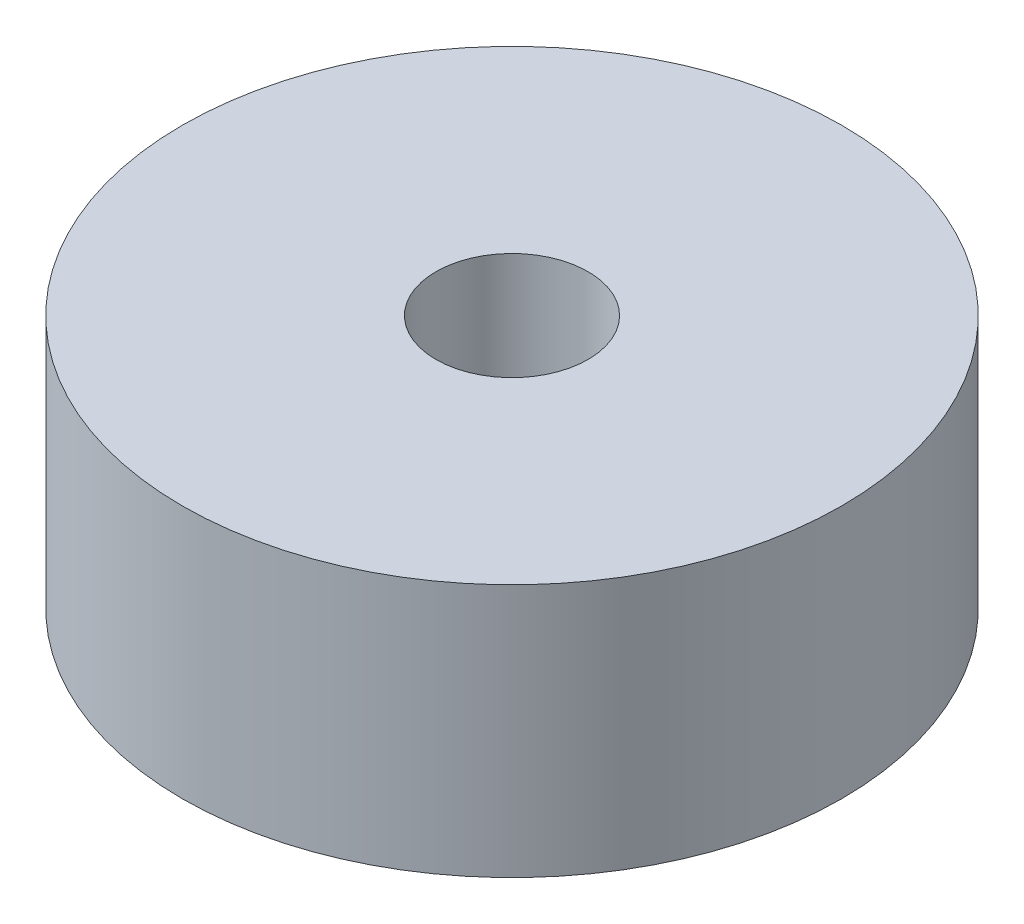
ISO-10303-21;
HEADER;
FILE_DESCRIPTION(('STEP AP214'),'2;1');
FILE_NAME('part.step','',(''),(''),'','','');
FILE_SCHEMA(('AUTOMOTIVE_DESIGN { 1 0 10303 214 1 1 1 1 }'));
ENDSEC;
DATA;
#1=APPLICATION_CONTEXT('core data for automotive mechanical design processes');
#2=APPLICATION_PROTOCOL_DEFINITION('international standard','automotive_design',2000,#1);
#3=PRODUCT_CONTEXT('',#1,'mechanical');
#4=PRODUCT('Part','Part','',(#3));
#5=PRODUCT_RELATED_PRODUCT_CATEGORY('part','',(#4));
#6=PRODUCT_DEFINITION_FORMATION('','',#4);
#7=PRODUCT_DEFINITION_CONTEXT('part definition',#1,'design');
#8=PRODUCT_DEFINITION('design','',#6,#7);
#9=PRODUCT_DEFINITION_SHAPE('','',#8);
#10=(LENGTH_UNIT() NAMED_UNIT(*) SI_UNIT(.MILLI.,.METRE.));
#11=(NAMED_UNIT(*) PLANE_ANGLE_UNIT() SI_UNIT($,.RADIAN.));
#12=(NAMED_UNIT(*) SI_UNIT($,.STERADIAN.) SOLID_ANGLE_UNIT());
#13=UNCERTAINTY_MEASURE_WITH_UNIT(LENGTH_MEASURE(1.E-05),#10,'distance_accuracy_value','');
#14=(GEOMETRIC_REPRESENTATION_CONTEXT(3) GLOBAL_UNCERTAINTY_ASSIGNED_CONTEXT((#13)) GLOBAL_UNIT_ASSIGNED_CONTEXT((#10,
#11,#12)) REPRESENTATION_CONTEXT('',''));
#15=CARTESIAN_POINT('',(0.,0.,0.));
#16=DIRECTION('',(0.,0.,1.));
#17=DIRECTION('',(1.,0.,0.));
#18=AXIS2_PLACEMENT_3D('',#15,#16,#17);
#19=CARTESIAN_POINT('',(0.,-5.,0.));
#20=DIRECTION('',(0.,1.,0.));
#21=DIRECTION('',(0.,0.,1.));
#22=AXIS2_PLACEMENT_3D('',#19,#20,#21);
#23=CYLINDRICAL_SURFACE('',#22,6.5);
#24=CARTESIAN_POINT('',(0.,-5.,0.));
#25=DIRECTION('',(0.,1.,0.));
#26=DIRECTION('',(0.,0.,1.));
#27=AXIS2_PLACEMENT_3D('',#24,#25,#26);
#28=CIRCLE('',#27,6.5);
#29=CARTESIAN_POINT('',(0.,-5.,6.5));
#30=VERTEX_POINT('',#29);
#31=EDGE_CURVE('E10',#30,#30,#28,.T.);
#32=ORIENTED_EDGE('',*,*,#31,.T.);
#33=EDGE_LOOP('',(#32));
#34=FACE_BOUND('',#33,.T.);
#35=CARTESIAN_POINT('',(0.,0.,0.));
#36=DIRECTION('',(0.,1.,0.));
#37=DIRECTION('',(0.,0.,1.));
#38=AXIS2_PLACEMENT_3D('',#35,#36,#37);
#39=CIRCLE('',#38,6.5);
#40=CARTESIAN_POINT('',(0.,0.,6.5));
#41=VERTEX_POINT('',#40);
#42=EDGE_CURVE('E36',#41,#41,#39,.T.);
#43=ORIENTED_EDGE('',*,*,#42,.F.);
#44=EDGE_LOOP('',(#43));
#45=FACE_BOUND('',#44,.T.);
#46=ADVANCED_FACE('F33',(#34,#45),#23,.T.);
#47=CARTESIAN_POINT('',(0.,-5.,0.));
#48=DIRECTION('',(0.,1.,0.));
#49=DIRECTION('',(0.,0.,1.));
#50=AXIS2_PLACEMENT_3D('',#47,#48,#49);
#51=PLANE('',#50);
#52=CARTESIAN_POINT('',(0.,-5.,0.));
#53=DIRECTION('',(0.,1.,0.));
#54=DIRECTION('',(0.,0.,1.));
#55=AXIS2_PLACEMENT_3D('',#52,#53,#54);
#56=CIRCLE('',#55,1.5);
#57=CARTESIAN_POINT('',(0.,-5.,1.5));
#58=VERTEX_POINT('',#57);
#59=EDGE_CURVE('E43',#58,#58,#56,.T.);
#60=ORIENTED_EDGE('',*,*,#59,.T.);
#61=EDGE_LOOP('',(#60));
#62=FACE_BOUND('',#61,.T.);
#63=ORIENTED_EDGE('',*,*,#31,.F.);
#64=EDGE_LOOP('',(#63));
#65=FACE_BOUND('',#64,.T.);
#66=ADVANCED_FACE('F51',(#62,#65),#51,.F.);
#67=CARTESIAN_POINT('',(0.,0.,0.));
#68=DIRECTION('',(0.,1.,0.));
#69=DIRECTION('',(0.,0.,1.));
#70=AXIS2_PLACEMENT_3D('',#67,#68,#69);
#71=PLANE('',#70);
#72=CARTESIAN_POINT('',(0.,0.,0.));
#73=DIRECTION('',(0.,1.,0.));
#74=DIRECTION('',(0.,0.,1.));
#75=AXIS2_PLACEMENT_3D('',#72,#73,#74);
#76=CIRCLE('',#75,1.5);
#77=CARTESIAN_POINT('',(0.,0.,1.5));
#78=VERTEX_POINT('',#77);
#79=EDGE_CURVE('E45',#78,#78,#76,.T.);
#80=ORIENTED_EDGE('',*,*,#79,.F.);
#81=EDGE_LOOP('',(#80));
#82=FACE_BOUND('',#81,.T.);
#83=ORIENTED_EDGE('',*,*,#42,.T.);
#84=EDGE_LOOP('',(#83));
#85=FACE_BOUND('',#84,.T.);
#86=ADVANCED_FACE('F57',(#82,#85),#71,.T.);
#87=CARTESIAN_POINT('',(0.,-5.,0.));
#88=DIRECTION('',(0.,1.,0.));
#89=DIRECTION('',(0.,0.,1.));
#90=AXIS2_PLACEMENT_3D('',#87,#88,#89);
#91=CYLINDRICAL_SURFACE('',#90,1.5);
#92=ORIENTED_EDGE('',*,*,#59,.F.);
#93=EDGE_LOOP('',(#92));
#94=FACE_BOUND('',#93,.T.);
#95=ORIENTED_EDGE('',*,*,#79,.T.);
#96=EDGE_LOOP('',(#95));
#97=FACE_BOUND('',#96,.T.);
#98=ADVANCED_FACE('F54',(#94,#97),#91,.F.);
#99=CLOSED_SHELL('',(#46,#66,#86,#98));
#100=MANIFOLD_SOLID_BREP('B2',#99);
#101=ADVANCED_BREP_SHAPE_REPRESENTATION('',(#18,#100),#14);
#102=SHAPE_DEFINITION_REPRESENTATION(#9,#101);
ENDSEC;
END-ISO-10303-21;
